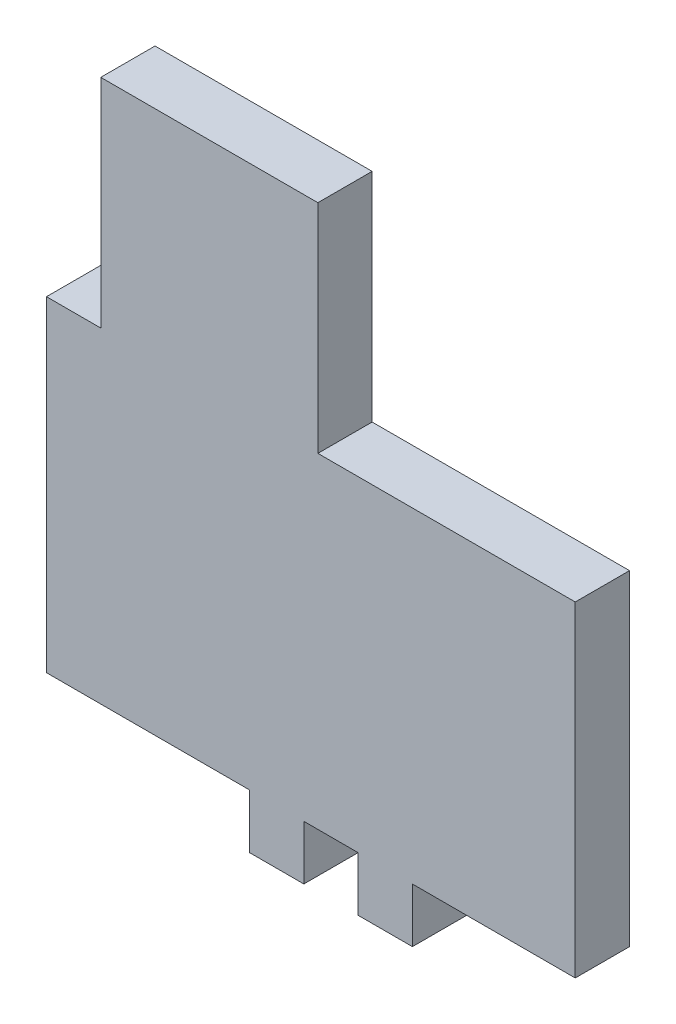
ISO-10303-21;
HEADER;
FILE_DESCRIPTION(('STEP AP214'),'2;1');
FILE_NAME('part.step','',(''),(''),'','','');
FILE_SCHEMA(('AUTOMOTIVE_DESIGN { 1 0 10303 214 1 1 1 1 }'));
ENDSEC;
DATA;
#1=APPLICATION_CONTEXT('core data for automotive mechanical design processes');
#2=APPLICATION_PROTOCOL_DEFINITION('international standard','automotive_design',2000,#1);
#3=PRODUCT_CONTEXT('',#1,'mechanical');
#4=PRODUCT('Part','Part','',(#3));
#5=PRODUCT_RELATED_PRODUCT_CATEGORY('part','',(#4));
#6=PRODUCT_DEFINITION_FORMATION('','',#4);
#7=PRODUCT_DEFINITION_CONTEXT('part definition',#1,'design');
#8=PRODUCT_DEFINITION('design','',#6,#7);
#9=PRODUCT_DEFINITION_SHAPE('','',#8);
#10=(LENGTH_UNIT() NAMED_UNIT(*) SI_UNIT(.MILLI.,.METRE.));
#11=(NAMED_UNIT(*) PLANE_ANGLE_UNIT() SI_UNIT($,.RADIAN.));
#12=(NAMED_UNIT(*) SI_UNIT($,.STERADIAN.) SOLID_ANGLE_UNIT());
#13=UNCERTAINTY_MEASURE_WITH_UNIT(LENGTH_MEASURE(1.E-05),#10,'distance_accuracy_value','');
#14=(GEOMETRIC_REPRESENTATION_CONTEXT(3) GLOBAL_UNCERTAINTY_ASSIGNED_CONTEXT((#13)) GLOBAL_UNIT_ASSIGNED_CONTEXT((#10,
#11,#12)) REPRESENTATION_CONTEXT('',''));
#15=CARTESIAN_POINT('',(0.,0.,0.));
#16=DIRECTION('',(0.,0.,1.));
#17=DIRECTION('',(1.,0.,0.));
#18=AXIS2_PLACEMENT_3D('',#15,#16,#17);
#19=CARTESIAN_POINT('',(-76.6518180277677,2.67022279677557,5.));
#20=DIRECTION('',(1.,0.,0.));
#21=DIRECTION('',(0.,0.,-1.));
#22=AXIS2_PLACEMENT_3D('',#19,#20,#21);
#23=PLANE('',#22);
#24=DIRECTION('',(0.,-1.,0.));
#25=VECTOR('',#24,1.);
#26=CARTESIAN_POINT('',(-76.6518180277677,2.67022279677557,0.));
#27=LINE('',#26,#25);
#28=CARTESIAN_POINT('',(-76.6518180277677,2.67022279677557,0.));
#29=VERTEX_POINT('',#28);
#30=CARTESIAN_POINT('',(-76.6518180277677,-27.3297772032244,0.));
#31=VERTEX_POINT('',#30);
#32=EDGE_CURVE('E177',#29,#31,#27,.T.);
#33=ORIENTED_EDGE('',*,*,#32,.T.);
#34=DIRECTION('',(0.,0.,-1.));
#35=VECTOR('',#34,1.);
#36=CARTESIAN_POINT('',(-76.6518180277677,-27.3297772032244,5.));
#37=LINE('',#36,#35);
#38=CARTESIAN_POINT('',(-76.6518180277677,-27.3297772032244,5.));
#39=VERTEX_POINT('',#38);
#40=EDGE_CURVE('E11',#39,#31,#37,.T.);
#41=ORIENTED_EDGE('',*,*,#40,.F.);
#42=DIRECTION('',(0.,-1.,0.));
#43=VECTOR('',#42,1.);
#44=CARTESIAN_POINT('',(-76.6518180277677,2.67022279677557,5.));
#45=LINE('',#44,#43);
#46=CARTESIAN_POINT('',(-76.6518180277677,2.67022279677557,5.));
#47=VERTEX_POINT('',#46);
#48=EDGE_CURVE('E207',#47,#39,#45,.T.);
#49=ORIENTED_EDGE('',*,*,#48,.F.);
#50=DIRECTION('',(0.,0.,-1.));
#51=VECTOR('',#50,1.);
#52=CARTESIAN_POINT('',(-76.6518180277677,2.67022279677557,5.));
#53=LINE('',#52,#51);
#54=EDGE_CURVE('E173',#47,#29,#53,.T.);
#55=ORIENTED_EDGE('',*,*,#54,.T.);
#56=EDGE_LOOP('',(#33,#41,#49,#55));
#57=FACE_BOUND('',#56,.T.);
#58=ADVANCED_FACE('F33',(#57),#23,.F.);
#59=CARTESIAN_POINT('',(-76.6518180277677,-27.3297772032244,5.));
#60=DIRECTION('',(0.,1.,0.));
#61=DIRECTION('',(-1.,0.,0.));
#62=AXIS2_PLACEMENT_3D('',#59,#60,#61);
#63=PLANE('',#62);
#64=DIRECTION('',(1.,0.,0.));
#65=VECTOR('',#64,1.);
#66=CARTESIAN_POINT('',(-76.6518180277677,-27.3297772032244,0.));
#67=LINE('',#66,#65);
#68=CARTESIAN_POINT('',(-57.9418180277677,-27.3297772032244,0.));
#69=VERTEX_POINT('',#68);
#70=EDGE_CURVE('E180',#31,#69,#67,.T.);
#71=ORIENTED_EDGE('',*,*,#70,.T.);
#72=DIRECTION('',(0.,0.,-1.));
#73=VECTOR('',#72,1.);
#74=CARTESIAN_POINT('',(-57.9418180277677,-27.3297772032244,5.));
#75=LINE('',#74,#73);
#76=CARTESIAN_POINT('',(-57.9418180277677,-27.3297772032244,5.));
#77=VERTEX_POINT('',#76);
#78=EDGE_CURVE('E41',#77,#69,#75,.T.);
#79=ORIENTED_EDGE('',*,*,#78,.F.);
#80=DIRECTION('',(1.,0.,0.));
#81=VECTOR('',#80,1.);
#82=CARTESIAN_POINT('',(-76.6518180277677,-27.3297772032244,5.));
#83=LINE('',#82,#81);
#84=EDGE_CURVE('E116',#39,#77,#83,.T.);
#85=ORIENTED_EDGE('',*,*,#84,.F.);
#86=ORIENTED_EDGE('',*,*,#40,.T.);
#87=EDGE_LOOP('',(#71,#79,#85,#86));
#88=FACE_BOUND('',#87,.T.);
#89=ADVANCED_FACE('F305',(#88),#63,.F.);
#90=CARTESIAN_POINT('',(-57.9418180277677,-27.3297772032244,5.));
#91=DIRECTION('',(1.,0.,0.));
#92=DIRECTION('',(0.,1.,0.));
#93=AXIS2_PLACEMENT_3D('',#90,#91,#92);
#94=PLANE('',#93);
#95=DIRECTION('',(0.,-1.,0.));
#96=VECTOR('',#95,1.);
#97=CARTESIAN_POINT('',(-57.9418180277677,-27.3297772032244,0.));
#98=LINE('',#97,#96);
#99=CARTESIAN_POINT('',(-57.9418180277677,-32.3297772032244,0.));
#100=VERTEX_POINT('',#99);
#101=EDGE_CURVE('E182',#69,#100,#98,.T.);
#102=ORIENTED_EDGE('',*,*,#101,.T.);
#103=DIRECTION('',(0.,0.,-1.));
#104=VECTOR('',#103,1.);
#105=CARTESIAN_POINT('',(-57.9418180277677,-32.3297772032244,5.));
#106=LINE('',#105,#104);
#107=CARTESIAN_POINT('',(-57.9418180277677,-32.3297772032244,5.));
#108=VERTEX_POINT('',#107);
#109=EDGE_CURVE('E238',#108,#100,#106,.T.);
#110=ORIENTED_EDGE('',*,*,#109,.F.);
#111=DIRECTION('',(0.,-1.,0.));
#112=VECTOR('',#111,1.);
#113=CARTESIAN_POINT('',(-57.9418180277677,-27.3297772032244,5.));
#114=LINE('',#113,#112);
#115=EDGE_CURVE('E246',#77,#108,#114,.T.);
#116=ORIENTED_EDGE('',*,*,#115,.F.);
#117=ORIENTED_EDGE('',*,*,#78,.T.);
#118=EDGE_LOOP('',(#102,#110,#116,#117));
#119=FACE_BOUND('',#118,.T.);
#120=ADVANCED_FACE('F244',(#119),#94,.F.);
#121=CARTESIAN_POINT('',(-57.9418180277677,-32.3297772032244,5.));
#122=DIRECTION('',(0.,1.,0.));
#123=DIRECTION('',(0.,0.,1.));
#124=AXIS2_PLACEMENT_3D('',#121,#122,#123);
#125=PLANE('',#124);
#126=DIRECTION('',(1.,0.,0.));
#127=VECTOR('',#126,1.);
#128=CARTESIAN_POINT('',(-57.9418180277677,-32.3297772032244,0.));
#129=LINE('',#128,#127);
#130=CARTESIAN_POINT('',(-52.9418180277677,-32.3297772032244,0.));
#131=VERTEX_POINT('',#130);
#132=EDGE_CURVE('E184',#100,#131,#129,.T.);
#133=ORIENTED_EDGE('',*,*,#132,.T.);
#134=DIRECTION('',(0.,0.,-1.));
#135=VECTOR('',#134,1.);
#136=CARTESIAN_POINT('',(-52.9418180277677,-32.3297772032244,5.));
#137=LINE('',#136,#135);
#138=CARTESIAN_POINT('',(-52.9418180277677,-32.3297772032244,5.));
#139=VERTEX_POINT('',#138);
#140=EDGE_CURVE('E235',#139,#131,#137,.T.);
#141=ORIENTED_EDGE('',*,*,#140,.F.);
#142=DIRECTION('',(1.,0.,0.));
#143=VECTOR('',#142,1.);
#144=CARTESIAN_POINT('',(-57.9418180277677,-32.3297772032244,5.));
#145=LINE('',#144,#143);
#146=EDGE_CURVE('E264',#108,#139,#145,.T.);
#147=ORIENTED_EDGE('',*,*,#146,.F.);
#148=ORIENTED_EDGE('',*,*,#109,.T.);
#149=EDGE_LOOP('',(#133,#141,#147,#148));
#150=FACE_BOUND('',#149,.T.);
#151=ADVANCED_FACE('F255',(#150),#125,.F.);
#152=CARTESIAN_POINT('',(-52.9418180277677,-32.3297772032244,5.));
#153=DIRECTION('',(-1.,0.,0.));
#154=DIRECTION('',(0.,-1.,0.));
#155=AXIS2_PLACEMENT_3D('',#152,#153,#154);
#156=PLANE('',#155);
#157=DIRECTION('',(0.,1.,0.));
#158=VECTOR('',#157,1.);
#159=CARTESIAN_POINT('',(-52.9418180277677,-32.3297772032244,0.));
#160=LINE('',#159,#158);
#161=CARTESIAN_POINT('',(-52.9418180277677,-27.3297772032244,0.));
#162=VERTEX_POINT('',#161);
#163=EDGE_CURVE('E186',#131,#162,#160,.T.);
#164=ORIENTED_EDGE('',*,*,#163,.T.);
#165=DIRECTION('',(0.,0.,-1.));
#166=VECTOR('',#165,1.);
#167=CARTESIAN_POINT('',(-52.9418180277677,-27.3297772032244,5.));
#168=LINE('',#167,#166);
#169=CARTESIAN_POINT('',(-52.9418180277677,-27.3297772032244,5.));
#170=VERTEX_POINT('',#169);
#171=EDGE_CURVE('E232',#170,#162,#168,.T.);
#172=ORIENTED_EDGE('',*,*,#171,.F.);
#173=DIRECTION('',(0.,1.,0.));
#174=VECTOR('',#173,1.);
#175=CARTESIAN_POINT('',(-52.9418180277677,-32.3297772032244,5.));
#176=LINE('',#175,#174);
#177=EDGE_CURVE('E261',#139,#170,#176,.T.);
#178=ORIENTED_EDGE('',*,*,#177,.F.);
#179=ORIENTED_EDGE('',*,*,#140,.T.);
#180=EDGE_LOOP('',(#164,#172,#178,#179));
#181=FACE_BOUND('',#180,.T.);
#182=ADVANCED_FACE('F259',(#181),#156,.F.);
#183=CARTESIAN_POINT('',(-52.9418180277677,-27.3297772032244,5.));
#184=DIRECTION('',(0.,1.,0.));
#185=DIRECTION('',(0.,0.,1.));
#186=AXIS2_PLACEMENT_3D('',#183,#184,#185);
#187=PLANE('',#186);
#188=DIRECTION('',(1.,0.,0.));
#189=VECTOR('',#188,1.);
#190=CARTESIAN_POINT('',(-52.9418180277677,-27.3297772032244,0.));
#191=LINE('',#190,#189);
#192=CARTESIAN_POINT('',(-47.9418180277677,-27.3297772032244,0.));
#193=VERTEX_POINT('',#192);
#194=EDGE_CURVE('E188',#162,#193,#191,.T.);
#195=ORIENTED_EDGE('',*,*,#194,.T.);
#196=DIRECTION('',(0.,0.,-1.));
#197=VECTOR('',#196,1.);
#198=CARTESIAN_POINT('',(-47.9418180277677,-27.3297772032244,5.));
#199=LINE('',#198,#197);
#200=CARTESIAN_POINT('',(-47.9418180277677,-27.3297772032244,5.));
#201=VERTEX_POINT('',#200);
#202=EDGE_CURVE('E229',#201,#193,#199,.T.);
#203=ORIENTED_EDGE('',*,*,#202,.F.);
#204=DIRECTION('',(1.,0.,0.));
#205=VECTOR('',#204,1.);
#206=CARTESIAN_POINT('',(-52.9418180277677,-27.3297772032244,5.));
#207=LINE('',#206,#205);
#208=EDGE_CURVE('E263',#170,#201,#207,.T.);
#209=ORIENTED_EDGE('',*,*,#208,.F.);
#210=ORIENTED_EDGE('',*,*,#171,.T.);
#211=EDGE_LOOP('',(#195,#203,#209,#210));
#212=FACE_BOUND('',#211,.T.);
#213=ADVANCED_FACE('F318',(#212),#187,.F.);
#214=CARTESIAN_POINT('',(-47.9418180277677,-27.3297772032244,5.));
#215=DIRECTION('',(1.,0.,0.));
#216=DIRECTION('',(0.,1.,0.));
#217=AXIS2_PLACEMENT_3D('',#214,#215,#216);
#218=PLANE('',#217);
#219=DIRECTION('',(0.,-1.,0.));
#220=VECTOR('',#219,1.);
#221=CARTESIAN_POINT('',(-47.9418180277677,-27.3297772032244,0.));
#222=LINE('',#221,#220);
#223=CARTESIAN_POINT('',(-47.9418180277677,-32.3297772032244,0.));
#224=VERTEX_POINT('',#223);
#225=EDGE_CURVE('E190',#193,#224,#222,.T.);
#226=ORIENTED_EDGE('',*,*,#225,.T.);
#227=DIRECTION('',(0.,0.,-1.));
#228=VECTOR('',#227,1.);
#229=CARTESIAN_POINT('',(-47.9418180277677,-32.3297772032244,5.));
#230=LINE('',#229,#228);
#231=CARTESIAN_POINT('',(-47.9418180277677,-32.3297772032244,5.));
#232=VERTEX_POINT('',#231);
#233=EDGE_CURVE('E226',#232,#224,#230,.T.);
#234=ORIENTED_EDGE('',*,*,#233,.F.);
#235=DIRECTION('',(0.,-1.,0.));
#236=VECTOR('',#235,1.);
#237=CARTESIAN_POINT('',(-47.9418180277677,-27.3297772032244,5.));
#238=LINE('',#237,#236);
#239=EDGE_CURVE('E266',#201,#232,#238,.T.);
#240=ORIENTED_EDGE('',*,*,#239,.F.);
#241=ORIENTED_EDGE('',*,*,#202,.T.);
#242=EDGE_LOOP('',(#226,#234,#240,#241));
#243=FACE_BOUND('',#242,.T.);
#244=ADVANCED_FACE('F321',(#243),#218,.F.);
#245=CARTESIAN_POINT('',(-47.9418180277677,-32.3297772032244,5.));
#246=DIRECTION('',(0.,1.,0.));
#247=DIRECTION('',(0.,0.,1.));
#248=AXIS2_PLACEMENT_3D('',#245,#246,#247);
#249=PLANE('',#248);
#250=DIRECTION('',(1.,0.,0.));
#251=VECTOR('',#250,1.);
#252=CARTESIAN_POINT('',(-47.9418180277677,-32.3297772032244,0.));
#253=LINE('',#252,#251);
#254=CARTESIAN_POINT('',(-42.9418180277677,-32.3297772032244,0.));
#255=VERTEX_POINT('',#254);
#256=EDGE_CURVE('E192',#224,#255,#253,.T.);
#257=ORIENTED_EDGE('',*,*,#256,.T.);
#258=DIRECTION('',(0.,0.,-1.));
#259=VECTOR('',#258,1.);
#260=CARTESIAN_POINT('',(-42.9418180277677,-32.3297772032244,5.));
#261=LINE('',#260,#259);
#262=CARTESIAN_POINT('',(-42.9418180277677,-32.3297772032244,5.));
#263=VERTEX_POINT('',#262);
#264=EDGE_CURVE('E223',#263,#255,#261,.T.);
#265=ORIENTED_EDGE('',*,*,#264,.F.);
#266=DIRECTION('',(1.,0.,0.));
#267=VECTOR('',#266,1.);
#268=CARTESIAN_POINT('',(-47.9418180277677,-32.3297772032244,5.));
#269=LINE('',#268,#267);
#270=EDGE_CURVE('E272',#232,#263,#269,.T.);
#271=ORIENTED_EDGE('',*,*,#270,.F.);
#272=ORIENTED_EDGE('',*,*,#233,.T.);
#273=EDGE_LOOP('',(#257,#265,#271,#272));
#274=FACE_BOUND('',#273,.T.);
#275=ADVANCED_FACE('F325',(#274),#249,.F.);
#276=CARTESIAN_POINT('',(-42.9418180277677,-32.3297772032244,5.));
#277=DIRECTION('',(-1.,0.,0.));
#278=DIRECTION('',(0.,0.,1.));
#279=AXIS2_PLACEMENT_3D('',#276,#277,#278);
#280=PLANE('',#279);
#281=DIRECTION('',(0.,1.,0.));
#282=VECTOR('',#281,1.);
#283=CARTESIAN_POINT('',(-42.9418180277677,-32.3297772032244,0.));
#284=LINE('',#283,#282);
#285=CARTESIAN_POINT('',(-42.9418180277677,-27.3297772032244,0.));
#286=VERTEX_POINT('',#285);
#287=EDGE_CURVE('E194',#255,#286,#284,.T.);
#288=ORIENTED_EDGE('',*,*,#287,.T.);
#289=DIRECTION('',(0.,0.,-1.));
#290=VECTOR('',#289,1.);
#291=CARTESIAN_POINT('',(-42.9418180277677,-27.3297772032244,5.));
#292=LINE('',#291,#290);
#293=CARTESIAN_POINT('',(-42.9418180277677,-27.3297772032244,5.));
#294=VERTEX_POINT('',#293);
#295=EDGE_CURVE('E220',#294,#286,#292,.T.);
#296=ORIENTED_EDGE('',*,*,#295,.F.);
#297=DIRECTION('',(0.,1.,0.));
#298=VECTOR('',#297,1.);
#299=CARTESIAN_POINT('',(-42.9418180277677,-32.3297772032244,5.));
#300=LINE('',#299,#298);
#301=EDGE_CURVE('E274',#263,#294,#300,.T.);
#302=ORIENTED_EDGE('',*,*,#301,.F.);
#303=ORIENTED_EDGE('',*,*,#264,.T.);
#304=EDGE_LOOP('',(#288,#296,#302,#303));
#305=FACE_BOUND('',#304,.T.);
#306=ADVANCED_FACE('F329',(#305),#280,.F.);
#307=CARTESIAN_POINT('',(-42.9418180277677,-27.3297772032244,5.));
#308=DIRECTION('',(0.,1.,0.));
#309=DIRECTION('',(0.,0.,1.));
#310=AXIS2_PLACEMENT_3D('',#307,#308,#309);
#311=PLANE('',#310);
#312=DIRECTION('',(1.,0.,0.));
#313=VECTOR('',#312,1.);
#314=CARTESIAN_POINT('',(-42.9418180277677,-27.3297772032244,0.));
#315=LINE('',#314,#313);
#316=CARTESIAN_POINT('',(-27.9418180277677,-27.3297772032244,0.));
#317=VERTEX_POINT('',#316);
#318=EDGE_CURVE('E196',#286,#317,#315,.T.);
#319=ORIENTED_EDGE('',*,*,#318,.T.);
#320=DIRECTION('',(0.,0.,-1.));
#321=VECTOR('',#320,1.);
#322=CARTESIAN_POINT('',(-27.9418180277677,-27.3297772032244,5.));
#323=LINE('',#322,#321);
#324=CARTESIAN_POINT('',(-27.9418180277677,-27.3297772032244,5.));
#325=VERTEX_POINT('',#324);
#326=EDGE_CURVE('E217',#325,#317,#323,.T.);
#327=ORIENTED_EDGE('',*,*,#326,.F.);
#328=DIRECTION('',(1.,0.,0.));
#329=VECTOR('',#328,1.);
#330=CARTESIAN_POINT('',(-42.9418180277677,-27.3297772032244,5.));
#331=LINE('',#330,#329);
#332=EDGE_CURVE('E276',#294,#325,#331,.T.);
#333=ORIENTED_EDGE('',*,*,#332,.F.);
#334=ORIENTED_EDGE('',*,*,#295,.T.);
#335=EDGE_LOOP('',(#319,#327,#333,#334));
#336=FACE_BOUND('',#335,.T.);
#337=ADVANCED_FACE('F333',(#336),#311,.F.);
#338=CARTESIAN_POINT('',(-27.9418180277677,-27.3297772032244,5.));
#339=DIRECTION('',(-1.,0.,0.));
#340=DIRECTION('',(0.,0.,1.));
#341=AXIS2_PLACEMENT_3D('',#338,#339,#340);
#342=PLANE('',#341);
#343=DIRECTION('',(0.,1.,0.));
#344=VECTOR('',#343,1.);
#345=CARTESIAN_POINT('',(-27.9418180277677,-27.3297772032244,0.));
#346=LINE('',#345,#344);
#347=CARTESIAN_POINT('',(-27.9418180277677,2.67022279677558,0.));
#348=VERTEX_POINT('',#347);
#349=EDGE_CURVE('E198',#317,#348,#346,.T.);
#350=ORIENTED_EDGE('',*,*,#349,.T.);
#351=DIRECTION('',(0.,0.,-1.));
#352=VECTOR('',#351,1.);
#353=CARTESIAN_POINT('',(-27.9418180277677,2.67022279677558,5.));
#354=LINE('',#353,#352);
#355=CARTESIAN_POINT('',(-27.9418180277677,2.67022279677558,5.));
#356=VERTEX_POINT('',#355);
#357=EDGE_CURVE('E214',#356,#348,#354,.T.);
#358=ORIENTED_EDGE('',*,*,#357,.F.);
#359=DIRECTION('',(0.,1.,0.));
#360=VECTOR('',#359,1.);
#361=CARTESIAN_POINT('',(-27.9418180277677,-27.3297772032244,5.));
#362=LINE('',#361,#360);
#363=EDGE_CURVE('E278',#325,#356,#362,.T.);
#364=ORIENTED_EDGE('',*,*,#363,.F.);
#365=ORIENTED_EDGE('',*,*,#326,.T.);
#366=EDGE_LOOP('',(#350,#358,#364,#365));
#367=FACE_BOUND('',#366,.T.);
#368=ADVANCED_FACE('F337',(#367),#342,.F.);
#369=CARTESIAN_POINT('',(-27.9418180277677,2.67022279677558,5.));
#370=DIRECTION('',(0.,-1.,0.));
#371=DIRECTION('',(1.,0.,0.));
#372=AXIS2_PLACEMENT_3D('',#369,#370,#371);
#373=PLANE('',#372);
#374=DIRECTION('',(-1.,0.,0.));
#375=VECTOR('',#374,1.);
#376=CARTESIAN_POINT('',(-27.9418180277677,2.67022279677558,0.));
#377=LINE('',#376,#375);
#378=CARTESIAN_POINT('',(-51.6518180277677,2.67022279677557,0.));
#379=VERTEX_POINT('',#378);
#380=EDGE_CURVE('E200',#348,#379,#377,.T.);
#381=ORIENTED_EDGE('',*,*,#380,.T.);
#382=DIRECTION('',(0.,0.,-1.));
#383=VECTOR('',#382,1.);
#384=CARTESIAN_POINT('',(-51.6518180277677,2.67022279677557,5.));
#385=LINE('',#384,#383);
#386=CARTESIAN_POINT('',(-51.6518180277677,2.67022279677557,5.));
#387=VERTEX_POINT('',#386);
#388=EDGE_CURVE('E211',#387,#379,#385,.T.);
#389=ORIENTED_EDGE('',*,*,#388,.F.);
#390=DIRECTION('',(-1.,0.,0.));
#391=VECTOR('',#390,1.);
#392=CARTESIAN_POINT('',(-27.9418180277677,2.67022279677558,5.));
#393=LINE('',#392,#391);
#394=EDGE_CURVE('E280',#356,#387,#393,.T.);
#395=ORIENTED_EDGE('',*,*,#394,.F.);
#396=ORIENTED_EDGE('',*,*,#357,.T.);
#397=EDGE_LOOP('',(#381,#389,#395,#396));
#398=FACE_BOUND('',#397,.T.);
#399=ADVANCED_FACE('F286',(#398),#373,.F.);
#400=CARTESIAN_POINT('',(-51.6518180277677,2.67022279677557,5.));
#401=DIRECTION('',(-1.,0.,0.));
#402=DIRECTION('',(0.,0.,1.));
#403=AXIS2_PLACEMENT_3D('',#400,#401,#402);
#404=PLANE('',#403);
#405=DIRECTION('',(0.,1.,0.));
#406=VECTOR('',#405,1.);
#407=CARTESIAN_POINT('',(-51.6518180277677,2.67022279677557,0.));
#408=LINE('',#407,#406);
#409=CARTESIAN_POINT('',(-51.6518180277677,22.6702227967756,0.));
#410=VERTEX_POINT('',#409);
#411=EDGE_CURVE('E202',#379,#410,#408,.T.);
#412=ORIENTED_EDGE('',*,*,#411,.T.);
#413=DIRECTION('',(0.,0.,-1.));
#414=VECTOR('',#413,1.);
#415=CARTESIAN_POINT('',(-51.6518180277677,22.6702227967756,5.));
#416=LINE('',#415,#414);
#417=CARTESIAN_POINT('',(-51.6518180277677,22.6702227967756,5.));
#418=VERTEX_POINT('',#417);
#419=EDGE_CURVE('E168',#418,#410,#416,.T.);
#420=ORIENTED_EDGE('',*,*,#419,.F.);
#421=DIRECTION('',(0.,1.,0.));
#422=VECTOR('',#421,1.);
#423=CARTESIAN_POINT('',(-51.6518180277677,2.67022279677557,5.));
#424=LINE('',#423,#422);
#425=EDGE_CURVE('E159',#387,#418,#424,.T.);
#426=ORIENTED_EDGE('',*,*,#425,.F.);
#427=ORIENTED_EDGE('',*,*,#388,.T.);
#428=EDGE_LOOP('',(#412,#420,#426,#427));
#429=FACE_BOUND('',#428,.T.);
#430=ADVANCED_FACE('F290',(#429),#404,.F.);
#431=CARTESIAN_POINT('',(-71.6518180277677,22.6702227967756,5.));
#432=DIRECTION('',(0.,-1.,0.));
#433=DIRECTION('',(0.,0.,-1.));
#434=AXIS2_PLACEMENT_3D('',#431,#432,#433);
#435=PLANE('',#434);
#436=DIRECTION('',(-1.,0.,0.));
#437=VECTOR('',#436,1.);
#438=CARTESIAN_POINT('',(-71.6518180277677,22.6702227967756,0.));
#439=LINE('',#438,#437);
#440=CARTESIAN_POINT('',(-71.6518180277677,22.6702227967756,0.));
#441=VERTEX_POINT('',#440);
#442=EDGE_CURVE('E167',#410,#441,#439,.T.);
#443=ORIENTED_EDGE('',*,*,#442,.T.);
#444=DIRECTION('',(0.,0.,-1.));
#445=VECTOR('',#444,1.);
#446=CARTESIAN_POINT('',(-71.6518180277677,22.6702227967756,5.));
#447=LINE('',#446,#445);
#448=CARTESIAN_POINT('',(-71.6518180277677,22.6702227967756,5.));
#449=VERTEX_POINT('',#448);
#450=EDGE_CURVE('E164',#449,#441,#447,.T.);
#451=ORIENTED_EDGE('',*,*,#450,.F.);
#452=DIRECTION('',(-1.,0.,0.));
#453=VECTOR('',#452,1.);
#454=CARTESIAN_POINT('',(-71.6518180277677,22.6702227967756,5.));
#455=LINE('',#454,#453);
#456=EDGE_CURVE('E153',#418,#449,#455,.T.);
#457=ORIENTED_EDGE('',*,*,#456,.F.);
#458=ORIENTED_EDGE('',*,*,#419,.T.);
#459=EDGE_LOOP('',(#443,#451,#457,#458));
#460=FACE_BOUND('',#459,.T.);
#461=ADVANCED_FACE('F165',(#460),#435,.F.);
#462=CARTESIAN_POINT('',(-71.6518180277677,2.67022279677557,5.));
#463=DIRECTION('',(1.,0.,0.));
#464=DIRECTION('',(0.,0.,-1.));
#465=AXIS2_PLACEMENT_3D('',#462,#463,#464);
#466=PLANE('',#465);
#467=DIRECTION('',(0.,-1.,0.));
#468=VECTOR('',#467,1.);
#469=CARTESIAN_POINT('',(-71.6518180277677,2.67022279677557,0.));
#470=LINE('',#469,#468);
#471=CARTESIAN_POINT('',(-71.6518180277677,2.67022279677557,0.));
#472=VERTEX_POINT('',#471);
#473=EDGE_CURVE('E102',#441,#472,#470,.T.);
#474=ORIENTED_EDGE('',*,*,#473,.T.);
#475=DIRECTION('',(0.,0.,-1.));
#476=VECTOR('',#475,1.);
#477=CARTESIAN_POINT('',(-71.6518180277677,2.67022279677557,5.));
#478=LINE('',#477,#476);
#479=CARTESIAN_POINT('',(-71.6518180277677,2.67022279677557,5.));
#480=VERTEX_POINT('',#479);
#481=EDGE_CURVE('E169',#480,#472,#478,.T.);
#482=ORIENTED_EDGE('',*,*,#481,.F.);
#483=DIRECTION('',(0.,-1.,0.));
#484=VECTOR('',#483,1.);
#485=CARTESIAN_POINT('',(-71.6518180277677,2.67022279677557,5.));
#486=LINE('',#485,#484);
#487=EDGE_CURVE('E157',#449,#480,#486,.T.);
#488=ORIENTED_EDGE('',*,*,#487,.F.);
#489=ORIENTED_EDGE('',*,*,#450,.T.);
#490=EDGE_LOOP('',(#474,#482,#488,#489));
#491=FACE_BOUND('',#490,.T.);
#492=ADVANCED_FACE('F171',(#491),#466,.F.);
#493=CARTESIAN_POINT('',(-76.6518180277677,2.67022279677557,5.));
#494=DIRECTION('',(0.,-1.,0.));
#495=DIRECTION('',(1.,0.,0.));
#496=AXIS2_PLACEMENT_3D('',#493,#494,#495);
#497=PLANE('',#496);
#498=DIRECTION('',(-1.,0.,0.));
#499=VECTOR('',#498,1.);
#500=CARTESIAN_POINT('',(-76.6518180277677,2.67022279677557,0.));
#501=LINE('',#500,#499);
#502=EDGE_CURVE('E108',#472,#29,#501,.T.);
#503=ORIENTED_EDGE('',*,*,#502,.T.);
#504=ORIENTED_EDGE('',*,*,#54,.F.);
#505=DIRECTION('',(-1.,0.,0.));
#506=VECTOR('',#505,1.);
#507=CARTESIAN_POINT('',(-76.6518180277677,2.67022279677557,5.));
#508=LINE('',#507,#506);
#509=EDGE_CURVE('E49',#480,#47,#508,.T.);
#510=ORIENTED_EDGE('',*,*,#509,.F.);
#511=ORIENTED_EDGE('',*,*,#481,.T.);
#512=EDGE_LOOP('',(#503,#504,#510,#511));
#513=FACE_BOUND('',#512,.T.);
#514=ADVANCED_FACE('F294',(#513),#497,.F.);
#515=CARTESIAN_POINT('',(0.,0.,5.));
#516=DIRECTION('',(0.,0.,1.));
#517=DIRECTION('',(1.,0.,0.));
#518=AXIS2_PLACEMENT_3D('',#515,#516,#517);
#519=PLANE('',#518);
#520=ORIENTED_EDGE('',*,*,#48,.T.);
#521=ORIENTED_EDGE('',*,*,#84,.T.);
#522=ORIENTED_EDGE('',*,*,#115,.T.);
#523=ORIENTED_EDGE('',*,*,#146,.T.);
#524=ORIENTED_EDGE('',*,*,#177,.T.);
#525=ORIENTED_EDGE('',*,*,#208,.T.);
#526=ORIENTED_EDGE('',*,*,#239,.T.);
#527=ORIENTED_EDGE('',*,*,#270,.T.);
#528=ORIENTED_EDGE('',*,*,#301,.T.);
#529=ORIENTED_EDGE('',*,*,#332,.T.);
#530=ORIENTED_EDGE('',*,*,#363,.T.);
#531=ORIENTED_EDGE('',*,*,#394,.T.);
#532=ORIENTED_EDGE('',*,*,#425,.T.);
#533=ORIENTED_EDGE('',*,*,#456,.T.);
#534=ORIENTED_EDGE('',*,*,#487,.T.);
#535=ORIENTED_EDGE('',*,*,#509,.T.);
#536=EDGE_LOOP('',(#520,#521,#522,#523,#524,#525,#526,#527,#528,#529,#530,#531,#532,#533,#534,#535));
#537=FACE_BOUND('',#536,.T.);
#538=ADVANCED_FACE('F155',(#537),#519,.T.);
#539=CARTESIAN_POINT('',(0.,0.,0.));
#540=DIRECTION('',(0.,0.,1.));
#541=DIRECTION('',(1.,0.,0.));
#542=AXIS2_PLACEMENT_3D('',#539,#540,#541);
#543=PLANE('',#542);
#544=ORIENTED_EDGE('',*,*,#32,.F.);
#545=ORIENTED_EDGE('',*,*,#502,.F.);
#546=ORIENTED_EDGE('',*,*,#473,.F.);
#547=ORIENTED_EDGE('',*,*,#442,.F.);
#548=ORIENTED_EDGE('',*,*,#411,.F.);
#549=ORIENTED_EDGE('',*,*,#380,.F.);
#550=ORIENTED_EDGE('',*,*,#349,.F.);
#551=ORIENTED_EDGE('',*,*,#318,.F.);
#552=ORIENTED_EDGE('',*,*,#287,.F.);
#553=ORIENTED_EDGE('',*,*,#256,.F.);
#554=ORIENTED_EDGE('',*,*,#225,.F.);
#555=ORIENTED_EDGE('',*,*,#194,.F.);
#556=ORIENTED_EDGE('',*,*,#163,.F.);
#557=ORIENTED_EDGE('',*,*,#132,.F.);
#558=ORIENTED_EDGE('',*,*,#101,.F.);
#559=ORIENTED_EDGE('',*,*,#70,.F.);
#560=EDGE_LOOP('',(#544,#545,#546,#547,#548,#549,#550,#551,#552,#553,#554,#555,#556,#557,#558,#559));
#561=FACE_BOUND('',#560,.T.);
#562=ADVANCED_FACE('F250',(#561),#543,.F.);
#563=CLOSED_SHELL('',(#58,#89,#120,#151,#182,#213,#244,#275,#306,#337,#368,#399,#430,#461,#492,
#514,#538,#562));
#564=MANIFOLD_SOLID_BREP('B2',#563);
#565=ADVANCED_BREP_SHAPE_REPRESENTATION('',(#18,#564),#14);
#566=SHAPE_DEFINITION_REPRESENTATION(#9,#565);
ENDSEC;
END-ISO-10303-21;
